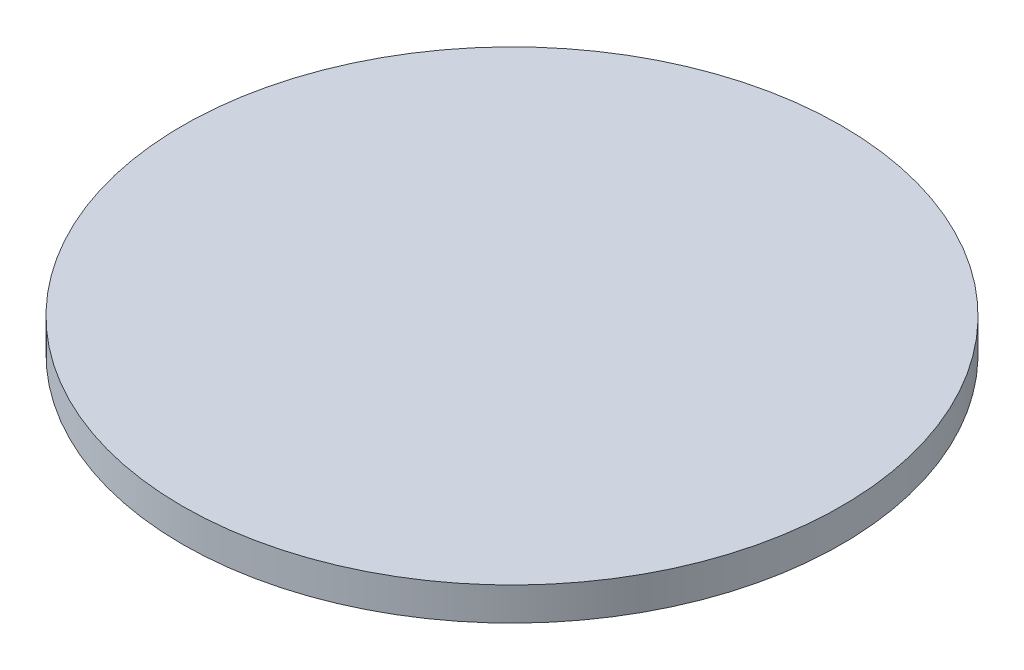
ISO-10303-21;
HEADER;
FILE_DESCRIPTION(('STEP AP214'),'2;1');
FILE_NAME('part.step','',(''),(''),'','','');
FILE_SCHEMA(('AUTOMOTIVE_DESIGN { 1 0 10303 214 1 1 1 1 }'));
ENDSEC;
DATA;
#1=APPLICATION_CONTEXT('core data for automotive mechanical design processes');
#2=APPLICATION_PROTOCOL_DEFINITION('international standard','automotive_design',2000,#1);
#3=PRODUCT_CONTEXT('',#1,'mechanical');
#4=PRODUCT('Part','Part','',(#3));
#5=PRODUCT_RELATED_PRODUCT_CATEGORY('part','',(#4));
#6=PRODUCT_DEFINITION_FORMATION('','',#4);
#7=PRODUCT_DEFINITION_CONTEXT('part definition',#1,'design');
#8=PRODUCT_DEFINITION('design','',#6,#7);
#9=PRODUCT_DEFINITION_SHAPE('','',#8);
#10=(LENGTH_UNIT() NAMED_UNIT(*) SI_UNIT(.MILLI.,.METRE.));
#11=(NAMED_UNIT(*) PLANE_ANGLE_UNIT() SI_UNIT($,.RADIAN.));
#12=(NAMED_UNIT(*) SI_UNIT($,.STERADIAN.) SOLID_ANGLE_UNIT());
#13=UNCERTAINTY_MEASURE_WITH_UNIT(LENGTH_MEASURE(1.E-05),#10,'distance_accuracy_value','');
#14=(GEOMETRIC_REPRESENTATION_CONTEXT(3) GLOBAL_UNCERTAINTY_ASSIGNED_CONTEXT((#13)) GLOBAL_UNIT_ASSIGNED_CONTEXT((#10,
#11,#12)) REPRESENTATION_CONTEXT('',''));
#15=CARTESIAN_POINT('',(0.,0.,0.));
#16=DIRECTION('',(0.,0.,1.));
#17=DIRECTION('',(1.,0.,0.));
#18=AXIS2_PLACEMENT_3D('',#15,#16,#17);
#19=CARTESIAN_POINT('',(0.,3.18,0.));
#20=DIRECTION('',(0.,-1.,0.));
#21=DIRECTION('',(0.,0.,-1.));
#22=AXIS2_PLACEMENT_3D('',#19,#20,#21);
#23=CYLINDRICAL_SURFACE('',#22,31.75);
#24=CARTESIAN_POINT('',(0.,3.18,0.));
#25=DIRECTION('',(0.,1.,0.));
#26=DIRECTION('',(0.,0.,1.));
#27=AXIS2_PLACEMENT_3D('',#24,#25,#26);
#28=CIRCLE('',#27,31.75);
#29=CARTESIAN_POINT('',(0.,3.18,-31.75));
#30=VERTEX_POINT('',#29);
#31=EDGE_CURVE('E10',#30,#30,#28,.T.);
#32=CARTESIAN_POINT('',(0.,0.,0.));
#33=DIRECTION('',(0.,1.,0.));
#34=DIRECTION('',(0.,0.,1.));
#35=AXIS2_PLACEMENT_3D('',#32,#33,#34);
#36=CIRCLE('',#35,31.75);
#37=CARTESIAN_POINT('',(0.,0.,-31.75));
#38=VERTEX_POINT('',#37);
#39=EDGE_CURVE('E40',#38,#38,#36,.T.);
#40=CARTESIAN_POINT('',(0.,3.18,-31.75));
#41=CARTESIAN_POINT('',(0.,3.146875,-31.75));
#42=CARTESIAN_POINT('',(0.,3.11375,-31.75));
#43=CARTESIAN_POINT('',(0.,3.0475,-31.75));
#44=CARTESIAN_POINT('',(0.,3.014375,-31.75));
#45=CARTESIAN_POINT('',(0.,2.948125,-31.75));
#46=CARTESIAN_POINT('',(0.,2.915,-31.75));
#47=CARTESIAN_POINT('',(0.,2.84875,-31.75));
#48=CARTESIAN_POINT('',(0.,2.815625,-31.75));
#49=CARTESIAN_POINT('',(0.,2.749375,-31.75));
#50=CARTESIAN_POINT('',(0.,2.71625,-31.75));
#51=CARTESIAN_POINT('',(0.,2.65,-31.75));
#52=CARTESIAN_POINT('',(0.,2.616875,-31.75));
#53=CARTESIAN_POINT('',(0.,2.550625,-31.75));
#54=CARTESIAN_POINT('',(0.,2.5175,-31.75));
#55=CARTESIAN_POINT('',(0.,2.45125,-31.75));
#56=CARTESIAN_POINT('',(0.,2.418125,-31.75));
#57=CARTESIAN_POINT('',(0.,2.351875,-31.75));
#58=CARTESIAN_POINT('',(0.,2.31875,-31.75));
#59=CARTESIAN_POINT('',(0.,2.2525,-31.75));
#60=CARTESIAN_POINT('',(0.,2.219375,-31.75));
#61=CARTESIAN_POINT('',(0.,2.153125,-31.75));
#62=CARTESIAN_POINT('',(0.,2.12,-31.75));
#63=CARTESIAN_POINT('',(0.,2.05375,-31.75));
#64=CARTESIAN_POINT('',(0.,2.020625,-31.75));
#65=CARTESIAN_POINT('',(0.,1.954375,-31.75));
#66=CARTESIAN_POINT('',(0.,1.92125,-31.75));
#67=CARTESIAN_POINT('',(0.,1.855,-31.75));
#68=CARTESIAN_POINT('',(0.,1.821875,-31.75));
#69=CARTESIAN_POINT('',(0.,1.755625,-31.75));
#70=CARTESIAN_POINT('',(0.,1.7225,-31.75));
#71=CARTESIAN_POINT('',(0.,1.65625,-31.75));
#72=CARTESIAN_POINT('',(0.,1.623125,-31.75));
#73=CARTESIAN_POINT('',(0.,1.556875,-31.75));
#74=CARTESIAN_POINT('',(0.,1.52375,-31.75));
#75=CARTESIAN_POINT('',(0.,1.4575,-31.75));
#76=CARTESIAN_POINT('',(0.,1.424375,-31.75));
#77=CARTESIAN_POINT('',(0.,1.358125,-31.75));
#78=CARTESIAN_POINT('',(0.,1.325,-31.75));
#79=CARTESIAN_POINT('',(0.,1.25875,-31.75));
#80=CARTESIAN_POINT('',(0.,1.225625,-31.75));
#81=CARTESIAN_POINT('',(0.,1.159375,-31.75));
#82=CARTESIAN_POINT('',(0.,1.12625,-31.75));
#83=CARTESIAN_POINT('',(0.,1.06,-31.75));
#84=CARTESIAN_POINT('',(0.,1.026875,-31.75));
#85=CARTESIAN_POINT('',(0.,0.960625,-31.75));
#86=CARTESIAN_POINT('',(0.,0.9275,-31.75));
#87=CARTESIAN_POINT('',(0.,0.86125,-31.75));
#88=CARTESIAN_POINT('',(0.,0.828125,-31.75));
#89=CARTESIAN_POINT('',(0.,0.761875,-31.75));
#90=CARTESIAN_POINT('',(0.,0.72875,-31.75));
#91=CARTESIAN_POINT('',(0.,0.6625,-31.75));
#92=CARTESIAN_POINT('',(0.,0.629375,-31.75));
#93=CARTESIAN_POINT('',(0.,0.563125,-31.75));
#94=CARTESIAN_POINT('',(0.,0.53,-31.75));
#95=CARTESIAN_POINT('',(0.,0.46375,-31.75));
#96=CARTESIAN_POINT('',(0.,0.430625,-31.75));
#97=CARTESIAN_POINT('',(0.,0.364375,-31.75));
#98=CARTESIAN_POINT('',(0.,0.33125,-31.75));
#99=CARTESIAN_POINT('',(0.,0.265,-31.75));
#100=CARTESIAN_POINT('',(0.,0.231875,-31.75));
#101=CARTESIAN_POINT('',(0.,0.165625,-31.75));
#102=CARTESIAN_POINT('',(0.,0.1325,-31.75));
#103=CARTESIAN_POINT('',(0.,0.06625,-31.75));
#104=CARTESIAN_POINT('',(0.,0.033125,-31.75));
#105=CARTESIAN_POINT('',(0.,0.,-31.75));
#106=B_SPLINE_CURVE_WITH_KNOTS('',3,(#40,#41,#42,#43,#44,#45,#46,#47,#48,#49,#50,#51,#52,#53,
#54,#55,#56,#57,#58,#59,#60,#61,#62,#63,#64,#65,#66,#67,#68,#69,#70,#71,#72,#73,#74,#75,#76,#77,
#78,#79,#80,#81,#82,#83,#84,#85,#86,#87,#88,#89,#90,#91,#92,#93,#94,#95,#96,#97,#98,#99,#100,
#101,#102,#103,#104,#105),.UNSPECIFIED.,.F.,.F.,(4,2,2,2,2,2,2,2,2,2,2,2,2,2,2,2,2,2,2,2,2,2,2,
2,2,2,2,2,2,2,2,2,4),(0.,0.0993749999999996,0.19875,0.298125,0.3975,0.496875,0.59625,0.695625,
0.795,0.894375,0.99375,1.093125,1.1925,1.291875,1.39125,1.490625,1.59,1.689375,1.78875,1.888125,
1.9875,2.086875,2.18625,2.285625,2.385,2.484375,2.58375,2.683125,2.7825,2.881875,2.98125,
3.080625,3.18),.UNSPECIFIED.);
#107=EDGE_CURVE('BSEAM37',#30,#38,#106,.T.);
#108=ORIENTED_EDGE('',*,*,#31,.F.);
#109=ORIENTED_EDGE('',*,*,#39,.T.);
#110=ORIENTED_EDGE('',*,*,#107,.T.);
#111=ORIENTED_EDGE('',*,*,#107,.F.);
#112=EDGE_LOOP('',(#108,#110,#109,#111));
#113=FACE_BOUND('',#112,.T.);
#114=ADVANCED_FACE('F37',(#113),#23,.T.);
#115=CARTESIAN_POINT('',(0.,3.18,0.));
#116=DIRECTION('',(0.,1.,0.));
#117=DIRECTION('',(0.,0.,1.));
#118=AXIS2_PLACEMENT_3D('',#115,#116,#117);
#119=PLANE('',#118);
#120=ORIENTED_EDGE('',*,*,#31,.T.);
#121=EDGE_LOOP('',(#120));
#122=FACE_BOUND('',#121,.T.);
#123=ADVANCED_FACE('F54',(#122),#119,.T.);
#124=CARTESIAN_POINT('',(0.,0.,0.));
#125=DIRECTION('',(0.,1.,0.));
#126=DIRECTION('',(0.,0.,1.));
#127=AXIS2_PLACEMENT_3D('',#124,#125,#126);
#128=PLANE('',#127);
#129=ORIENTED_EDGE('',*,*,#39,.F.);
#130=EDGE_LOOP('',(#129));
#131=FACE_BOUND('',#130,.T.);
#132=ADVANCED_FACE('F52',(#131),#128,.F.);
#133=CLOSED_SHELL('',(#114,#123,#132));
#134=MANIFOLD_SOLID_BREP('B2',#133);
#135=ADVANCED_BREP_SHAPE_REPRESENTATION('',(#18,#134),#14);
#136=SHAPE_DEFINITION_REPRESENTATION(#9,#135);
ENDSEC;
END-ISO-10303-21;
